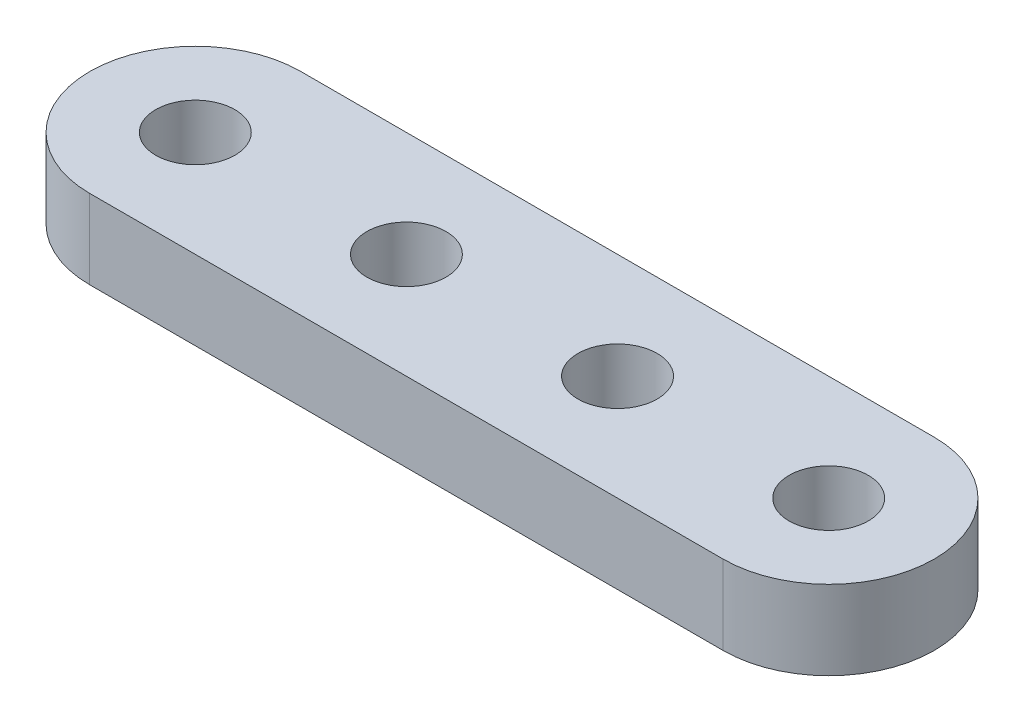
ISO-10303-21;
HEADER;
FILE_DESCRIPTION(('STEP AP214'),'2;1');
FILE_NAME('part.step','',(''),(''),'','','');
FILE_SCHEMA(('AUTOMOTIVE_DESIGN { 1 0 10303 214 1 1 1 1 }'));
ENDSEC;
DATA;
#1=APPLICATION_CONTEXT('core data for automotive mechanical design processes');
#2=APPLICATION_PROTOCOL_DEFINITION('international standard','automotive_design',2000,#1);
#3=PRODUCT_CONTEXT('',#1,'mechanical');
#4=PRODUCT('Part','Part','',(#3));
#5=PRODUCT_RELATED_PRODUCT_CATEGORY('part','',(#4));
#6=PRODUCT_DEFINITION_FORMATION('','',#4);
#7=PRODUCT_DEFINITION_CONTEXT('part definition',#1,'design');
#8=PRODUCT_DEFINITION('design','',#6,#7);
#9=PRODUCT_DEFINITION_SHAPE('','',#8);
#10=(LENGTH_UNIT() NAMED_UNIT(*) SI_UNIT(.MILLI.,.METRE.));
#11=(NAMED_UNIT(*) PLANE_ANGLE_UNIT() SI_UNIT($,.RADIAN.));
#12=(NAMED_UNIT(*) SI_UNIT($,.STERADIAN.) SOLID_ANGLE_UNIT());
#13=UNCERTAINTY_MEASURE_WITH_UNIT(LENGTH_MEASURE(1.E-05),#10,'distance_accuracy_value','');
#14=(GEOMETRIC_REPRESENTATION_CONTEXT(3) GLOBAL_UNCERTAINTY_ASSIGNED_CONTEXT((#13)) GLOBAL_UNIT_ASSIGNED_CONTEXT((#10,
#11,#12)) REPRESENTATION_CONTEXT('',''));
#15=CARTESIAN_POINT('',(0.,0.,0.));
#16=DIRECTION('',(0.,0.,1.));
#17=DIRECTION('',(1.,0.,0.));
#18=AXIS2_PLACEMENT_3D('',#15,#16,#17);
#19=CARTESIAN_POINT('',(0.,3.,0.));
#20=DIRECTION('',(0.,1.,0.));
#21=DIRECTION('',(0.,0.,1.));
#22=AXIS2_PLACEMENT_3D('',#19,#20,#21);
#23=PLANE('',#22);
#24=CARTESIAN_POINT('',(16.,3.,0.));
#25=DIRECTION('',(0.,1.,0.));
#26=DIRECTION('',(0.,0.,1.));
#27=AXIS2_PLACEMENT_3D('',#24,#25,#26);
#28=CIRCLE('',#27,1.5);
#29=CARTESIAN_POINT('',(16.,3.,1.5));
#30=VERTEX_POINT('',#29);
#31=EDGE_CURVE('E123',#30,#30,#28,.T.);
#32=ORIENTED_EDGE('',*,*,#31,.F.);
#33=EDGE_LOOP('',(#32));
#34=FACE_BOUND('',#33,.T.);
#35=CARTESIAN_POINT('',(0.,3.,0.));
#36=DIRECTION('',(0.,1.,0.));
#37=DIRECTION('',(0.,0.,1.));
#38=AXIS2_PLACEMENT_3D('',#35,#36,#37);
#39=CIRCLE('',#38,1.5);
#40=CARTESIAN_POINT('',(0.,3.,1.5));
#41=VERTEX_POINT('',#40);
#42=EDGE_CURVE('E102',#41,#41,#39,.T.);
#43=ORIENTED_EDGE('',*,*,#42,.F.);
#44=EDGE_LOOP('',(#43));
#45=FACE_BOUND('',#44,.T.);
#46=CARTESIAN_POINT('',(0.,3.,0.));
#47=DIRECTION('',(0.,1.,0.));
#48=DIRECTION('',(0.,0.,1.));
#49=AXIS2_PLACEMENT_3D('',#46,#47,#48);
#50=CIRCLE('',#49,4.);
#51=CARTESIAN_POINT('',(0.,3.,-4.));
#52=VERTEX_POINT('',#51);
#53=CARTESIAN_POINT('',(0.,3.,4.));
#54=VERTEX_POINT('',#53);
#55=EDGE_CURVE('E87',#52,#54,#50,.T.);
#56=ORIENTED_EDGE('',*,*,#55,.T.);
#57=DIRECTION('',(1.,0.,0.));
#58=VECTOR('',#57,1.);
#59=CARTESIAN_POINT('',(0.,3.,4.));
#60=LINE('',#59,#58);
#61=CARTESIAN_POINT('',(24.,3.,4.));
#62=VERTEX_POINT('',#61);
#63=EDGE_CURVE('E82',#54,#62,#60,.T.);
#64=ORIENTED_EDGE('',*,*,#63,.T.);
#65=CARTESIAN_POINT('',(24.,3.,0.));
#66=DIRECTION('',(0.,1.,0.));
#67=DIRECTION('',(0.,0.,1.));
#68=AXIS2_PLACEMENT_3D('',#65,#66,#67);
#69=CIRCLE('',#68,4.);
#70=CARTESIAN_POINT('',(24.,3.,-4.));
#71=VERTEX_POINT('',#70);
#72=EDGE_CURVE('E85',#62,#71,#69,.T.);
#73=ORIENTED_EDGE('',*,*,#72,.T.);
#74=DIRECTION('',(-1.,0.,0.));
#75=VECTOR('',#74,1.);
#76=CARTESIAN_POINT('',(0.,3.,-4.));
#77=LINE('',#76,#75);
#78=EDGE_CURVE('E52',#71,#52,#77,.T.);
#79=ORIENTED_EDGE('',*,*,#78,.T.);
#80=EDGE_LOOP('',(#56,#64,#73,#79));
#81=FACE_BOUND('',#80,.T.);
#82=CARTESIAN_POINT('',(8.,3.,0.));
#83=DIRECTION('',(0.,1.,0.));
#84=DIRECTION('',(0.,0.,1.));
#85=AXIS2_PLACEMENT_3D('',#82,#83,#84);
#86=CIRCLE('',#85,1.5);
#87=CARTESIAN_POINT('',(8.,3.,1.5));
#88=VERTEX_POINT('',#87);
#89=EDGE_CURVE('E117',#88,#88,#86,.T.);
#90=ORIENTED_EDGE('',*,*,#89,.F.);
#91=EDGE_LOOP('',(#90));
#92=FACE_BOUND('',#91,.T.);
#93=CARTESIAN_POINT('',(24.,3.,0.));
#94=DIRECTION('',(0.,1.,0.));
#95=DIRECTION('',(0.,0.,1.));
#96=AXIS2_PLACEMENT_3D('',#93,#94,#95);
#97=CIRCLE('',#96,1.5);
#98=CARTESIAN_POINT('',(24.,3.,1.5));
#99=VERTEX_POINT('',#98);
#100=EDGE_CURVE('E129',#99,#99,#97,.T.);
#101=ORIENTED_EDGE('',*,*,#100,.F.);
#102=EDGE_LOOP('',(#101));
#103=FACE_BOUND('',#102,.T.);
#104=ADVANCED_FACE('F35',(#34,#45,#81,#92,#103),#23,.T.);
#105=CARTESIAN_POINT('',(0.,0.,0.));
#106=DIRECTION('',(0.,1.,0.));
#107=DIRECTION('',(0.,0.,1.));
#108=AXIS2_PLACEMENT_3D('',#105,#106,#107);
#109=PLANE('',#108);
#110=CARTESIAN_POINT('',(0.,0.,0.));
#111=DIRECTION('',(0.,1.,0.));
#112=DIRECTION('',(0.,0.,1.));
#113=AXIS2_PLACEMENT_3D('',#110,#111,#112);
#114=CIRCLE('',#113,4.);
#115=CARTESIAN_POINT('',(0.,0.,-4.));
#116=VERTEX_POINT('',#115);
#117=CARTESIAN_POINT('',(0.,0.,4.));
#118=VERTEX_POINT('',#117);
#119=EDGE_CURVE('E99',#116,#118,#114,.T.);
#120=ORIENTED_EDGE('',*,*,#119,.F.);
#121=DIRECTION('',(-1.,0.,0.));
#122=VECTOR('',#121,1.);
#123=CARTESIAN_POINT('',(0.,0.,-4.));
#124=LINE('',#123,#122);
#125=CARTESIAN_POINT('',(24.,0.,-4.));
#126=VERTEX_POINT('',#125);
#127=EDGE_CURVE('E75',#126,#116,#124,.T.);
#128=ORIENTED_EDGE('',*,*,#127,.F.);
#129=CARTESIAN_POINT('',(24.,0.,0.));
#130=DIRECTION('',(0.,1.,0.));
#131=DIRECTION('',(0.,0.,1.));
#132=AXIS2_PLACEMENT_3D('',#129,#130,#131);
#133=CIRCLE('',#132,4.);
#134=CARTESIAN_POINT('',(24.,0.,4.));
#135=VERTEX_POINT('',#134);
#136=EDGE_CURVE('E69',#135,#126,#133,.T.);
#137=ORIENTED_EDGE('',*,*,#136,.F.);
#138=DIRECTION('',(1.,0.,0.));
#139=VECTOR('',#138,1.);
#140=CARTESIAN_POINT('',(0.,0.,4.));
#141=LINE('',#140,#139);
#142=EDGE_CURVE('E91',#118,#135,#141,.T.);
#143=ORIENTED_EDGE('',*,*,#142,.F.);
#144=EDGE_LOOP('',(#120,#128,#137,#143));
#145=FACE_BOUND('',#144,.T.);
#146=CARTESIAN_POINT('',(0.,0.,0.));
#147=DIRECTION('',(0.,1.,0.));
#148=DIRECTION('',(0.,0.,1.));
#149=AXIS2_PLACEMENT_3D('',#146,#147,#148);
#150=CIRCLE('',#149,1.5);
#151=CARTESIAN_POINT('',(0.,0.,1.5));
#152=VERTEX_POINT('',#151);
#153=EDGE_CURVE('E114',#152,#152,#150,.T.);
#154=ORIENTED_EDGE('',*,*,#153,.T.);
#155=EDGE_LOOP('',(#154));
#156=FACE_BOUND('',#155,.T.);
#157=CARTESIAN_POINT('',(8.,0.,0.));
#158=DIRECTION('',(0.,1.,0.));
#159=DIRECTION('',(0.,0.,1.));
#160=AXIS2_PLACEMENT_3D('',#157,#158,#159);
#161=CIRCLE('',#160,1.5);
#162=CARTESIAN_POINT('',(8.,0.,1.5));
#163=VERTEX_POINT('',#162);
#164=EDGE_CURVE('E120',#163,#163,#161,.T.);
#165=ORIENTED_EDGE('',*,*,#164,.T.);
#166=EDGE_LOOP('',(#165));
#167=FACE_BOUND('',#166,.T.);
#168=CARTESIAN_POINT('',(16.,0.,0.));
#169=DIRECTION('',(0.,1.,0.));
#170=DIRECTION('',(0.,0.,1.));
#171=AXIS2_PLACEMENT_3D('',#168,#169,#170);
#172=CIRCLE('',#171,1.5);
#173=CARTESIAN_POINT('',(16.,0.,1.5));
#174=VERTEX_POINT('',#173);
#175=EDGE_CURVE('E126',#174,#174,#172,.T.);
#176=ORIENTED_EDGE('',*,*,#175,.T.);
#177=EDGE_LOOP('',(#176));
#178=FACE_BOUND('',#177,.T.);
#179=CARTESIAN_POINT('',(24.,0.,0.));
#180=DIRECTION('',(0.,1.,0.));
#181=DIRECTION('',(0.,0.,1.));
#182=AXIS2_PLACEMENT_3D('',#179,#180,#181);
#183=CIRCLE('',#182,1.5);
#184=CARTESIAN_POINT('',(24.,0.,1.5));
#185=VERTEX_POINT('',#184);
#186=EDGE_CURVE('E132',#185,#185,#183,.T.);
#187=ORIENTED_EDGE('',*,*,#186,.T.);
#188=EDGE_LOOP('',(#187));
#189=FACE_BOUND('',#188,.T.);
#190=ADVANCED_FACE('F110',(#145,#156,#167,#178,#189),#109,.F.);
#191=CARTESIAN_POINT('',(0.,3.,0.));
#192=DIRECTION('',(0.,-1.,0.));
#193=DIRECTION('',(0.,0.,-1.));
#194=AXIS2_PLACEMENT_3D('',#191,#192,#193);
#195=CYLINDRICAL_SURFACE('',#194,4.);
#196=ORIENTED_EDGE('',*,*,#119,.T.);
#197=DIRECTION('',(0.,-1.,0.));
#198=VECTOR('',#197,1.);
#199=CARTESIAN_POINT('',(0.,3.,4.));
#200=LINE('',#199,#198);
#201=EDGE_CURVE('E11',#54,#118,#200,.T.);
#202=ORIENTED_EDGE('',*,*,#201,.F.);
#203=ORIENTED_EDGE('',*,*,#55,.F.);
#204=DIRECTION('',(0.,-1.,0.));
#205=VECTOR('',#204,1.);
#206=CARTESIAN_POINT('',(0.,3.,-4.));
#207=LINE('',#206,#205);
#208=EDGE_CURVE('E95',#52,#116,#207,.T.);
#209=ORIENTED_EDGE('',*,*,#208,.T.);
#210=EDGE_LOOP('',(#196,#202,#203,#209));
#211=FACE_BOUND('',#210,.T.);
#212=ADVANCED_FACE('F37',(#211),#195,.T.);
#213=CARTESIAN_POINT('',(0.,3.,4.));
#214=DIRECTION('',(0.,0.,-1.));
#215=DIRECTION('',(-1.,0.,0.));
#216=AXIS2_PLACEMENT_3D('',#213,#214,#215);
#217=PLANE('',#216);
#218=ORIENTED_EDGE('',*,*,#142,.T.);
#219=DIRECTION('',(0.,-1.,0.));
#220=VECTOR('',#219,1.);
#221=CARTESIAN_POINT('',(24.,3.,4.));
#222=LINE('',#221,#220);
#223=EDGE_CURVE('E44',#62,#135,#222,.T.);
#224=ORIENTED_EDGE('',*,*,#223,.F.);
#225=ORIENTED_EDGE('',*,*,#63,.F.);
#226=ORIENTED_EDGE('',*,*,#201,.T.);
#227=EDGE_LOOP('',(#218,#224,#225,#226));
#228=FACE_BOUND('',#227,.T.);
#229=ADVANCED_FACE('F90',(#228),#217,.F.);
#230=CARTESIAN_POINT('',(24.,3.,0.));
#231=DIRECTION('',(0.,-1.,0.));
#232=DIRECTION('',(0.,0.,-1.));
#233=AXIS2_PLACEMENT_3D('',#230,#231,#232);
#234=CYLINDRICAL_SURFACE('',#233,4.);
#235=ORIENTED_EDGE('',*,*,#136,.T.);
#236=DIRECTION('',(0.,-1.,0.));
#237=VECTOR('',#236,1.);
#238=CARTESIAN_POINT('',(24.,3.,-4.));
#239=LINE('',#238,#237);
#240=EDGE_CURVE('E92',#71,#126,#239,.T.);
#241=ORIENTED_EDGE('',*,*,#240,.F.);
#242=ORIENTED_EDGE('',*,*,#72,.F.);
#243=ORIENTED_EDGE('',*,*,#223,.T.);
#244=EDGE_LOOP('',(#235,#241,#242,#243));
#245=FACE_BOUND('',#244,.T.);
#246=ADVANCED_FACE('F93',(#245),#234,.T.);
#247=CARTESIAN_POINT('',(0.,3.,-4.));
#248=DIRECTION('',(0.,0.,1.));
#249=DIRECTION('',(1.,0.,0.));
#250=AXIS2_PLACEMENT_3D('',#247,#248,#249);
#251=PLANE('',#250);
#252=ORIENTED_EDGE('',*,*,#127,.T.);
#253=ORIENTED_EDGE('',*,*,#208,.F.);
#254=ORIENTED_EDGE('',*,*,#78,.F.);
#255=ORIENTED_EDGE('',*,*,#240,.T.);
#256=EDGE_LOOP('',(#252,#253,#254,#255));
#257=FACE_BOUND('',#256,.T.);
#258=ADVANCED_FACE('F107',(#257),#251,.F.);
#259=CARTESIAN_POINT('',(0.,3.,0.));
#260=DIRECTION('',(0.,-1.,0.));
#261=DIRECTION('',(0.,0.,-1.));
#262=AXIS2_PLACEMENT_3D('',#259,#260,#261);
#263=CYLINDRICAL_SURFACE('',#262,1.5);
#264=ORIENTED_EDGE('',*,*,#42,.T.);
#265=EDGE_LOOP('',(#264));
#266=FACE_BOUND('',#265,.T.);
#267=ORIENTED_EDGE('',*,*,#153,.F.);
#268=EDGE_LOOP('',(#267));
#269=FACE_BOUND('',#268,.T.);
#270=ADVANCED_FACE('F151',(#266,#269),#263,.F.);
#271=CARTESIAN_POINT('',(8.,3.,0.));
#272=DIRECTION('',(0.,-1.,0.));
#273=DIRECTION('',(0.,0.,-1.));
#274=AXIS2_PLACEMENT_3D('',#271,#272,#273);
#275=CYLINDRICAL_SURFACE('',#274,1.5);
#276=ORIENTED_EDGE('',*,*,#89,.T.);
#277=EDGE_LOOP('',(#276));
#278=FACE_BOUND('',#277,.T.);
#279=ORIENTED_EDGE('',*,*,#164,.F.);
#280=EDGE_LOOP('',(#279));
#281=FACE_BOUND('',#280,.T.);
#282=ADVANCED_FACE('F197',(#278,#281),#275,.F.);
#283=CARTESIAN_POINT('',(16.,3.,0.));
#284=DIRECTION('',(0.,-1.,0.));
#285=DIRECTION('',(0.,0.,-1.));
#286=AXIS2_PLACEMENT_3D('',#283,#284,#285);
#287=CYLINDRICAL_SURFACE('',#286,1.5);
#288=ORIENTED_EDGE('',*,*,#31,.T.);
#289=EDGE_LOOP('',(#288));
#290=FACE_BOUND('',#289,.T.);
#291=ORIENTED_EDGE('',*,*,#175,.F.);
#292=EDGE_LOOP('',(#291));
#293=FACE_BOUND('',#292,.T.);
#294=ADVANCED_FACE('F205',(#290,#293),#287,.F.);
#295=CARTESIAN_POINT('',(24.,3.,0.));
#296=DIRECTION('',(0.,-1.,0.));
#297=DIRECTION('',(0.,0.,-1.));
#298=AXIS2_PLACEMENT_3D('',#295,#296,#297);
#299=CYLINDRICAL_SURFACE('',#298,1.5);
#300=ORIENTED_EDGE('',*,*,#100,.T.);
#301=EDGE_LOOP('',(#300));
#302=FACE_BOUND('',#301,.T.);
#303=ORIENTED_EDGE('',*,*,#186,.F.);
#304=EDGE_LOOP('',(#303));
#305=FACE_BOUND('',#304,.T.);
#306=ADVANCED_FACE('F138',(#302,#305),#299,.F.);
#307=CLOSED_SHELL('',(#104,#190,#212,#229,#246,#258,#270,#282,#294,#306));
#308=MANIFOLD_SOLID_BREP('B2',#307);
#309=ADVANCED_BREP_SHAPE_REPRESENTATION('',(#18,#308),#14);
#310=SHAPE_DEFINITION_REPRESENTATION(#9,#309);
ENDSEC;
END-ISO-10303-21;
